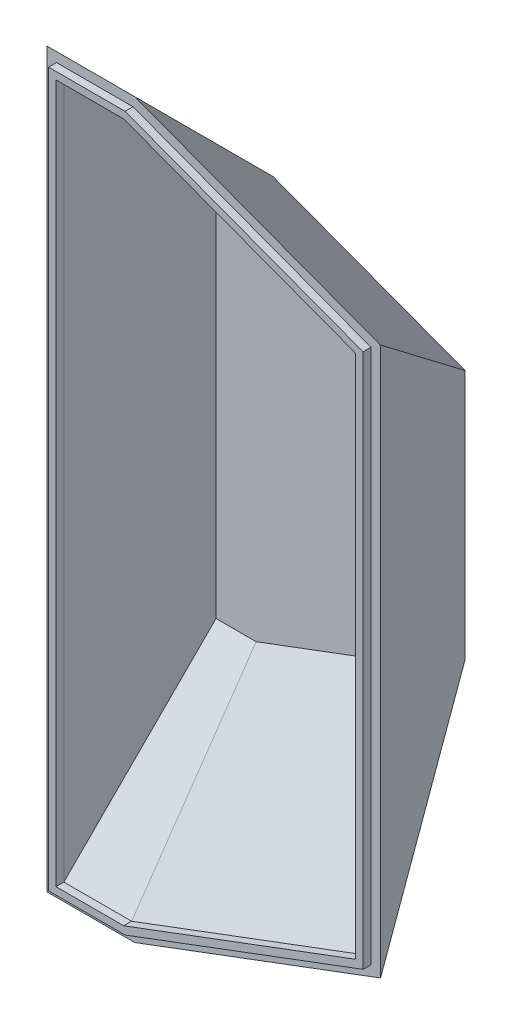
ISO-10303-21;
HEADER;
FILE_DESCRIPTION(('STEP AP214'),'2;1');
FILE_NAME('part.step','',(''),(''),'','','');
FILE_SCHEMA(('AUTOMOTIVE_DESIGN { 1 0 10303 214 1 1 1 1 }'));
ENDSEC;
DATA;
#1=APPLICATION_CONTEXT('core data for automotive mechanical design processes');
#2=APPLICATION_PROTOCOL_DEFINITION('international standard','automotive_design',2000,#1);
#3=PRODUCT_CONTEXT('',#1,'mechanical');
#4=PRODUCT('Part','Part','',(#3));
#5=PRODUCT_RELATED_PRODUCT_CATEGORY('part','',(#4));
#6=PRODUCT_DEFINITION_FORMATION('','',#4);
#7=PRODUCT_DEFINITION_CONTEXT('part definition',#1,'design');
#8=PRODUCT_DEFINITION('design','',#6,#7);
#9=PRODUCT_DEFINITION_SHAPE('','',#8);
#10=(LENGTH_UNIT() NAMED_UNIT(*) SI_UNIT(.MILLI.,.METRE.));
#11=(NAMED_UNIT(*) PLANE_ANGLE_UNIT() SI_UNIT($,.RADIAN.));
#12=(NAMED_UNIT(*) SI_UNIT($,.STERADIAN.) SOLID_ANGLE_UNIT());
#13=UNCERTAINTY_MEASURE_WITH_UNIT(LENGTH_MEASURE(1.E-05),#10,'distance_accuracy_value','');
#14=(GEOMETRIC_REPRESENTATION_CONTEXT(3) GLOBAL_UNCERTAINTY_ASSIGNED_CONTEXT((#13)) GLOBAL_UNIT_ASSIGNED_CONTEXT((#10,
#11,#12)) REPRESENTATION_CONTEXT('',''));
#15=CARTESIAN_POINT('',(0.,0.,0.));
#16=DIRECTION('',(0.,0.,1.));
#17=DIRECTION('',(1.,0.,0.));
#18=AXIS2_PLACEMENT_3D('',#15,#16,#17);
#19=CARTESIAN_POINT('',(0.550172499144787,-1.46712666438611,0.889));
#20=DIRECTION('',(0.35112344158839,-0.936329177569045,0.));
#21=DIRECTION('',(0.936329177569045,0.35112344158839,0.));
#22=AXIS2_PLACEMENT_3D('',#19,#20,#21);
#23=PLANE('',#22);
#24=CARTESIAN_POINT('',(35.6782200809877,11.7058911788049,0.));
#25=DIRECTION('',(-0.936329177569045,-0.35112344158839,0.));
#26=VECTOR('',#25,1.);
#27=LINE('',#24,#26);
#28=CARTESIAN_POINT('',(35.6782200809877,11.7058911788049,0.));
#29=VERTEX_POINT('',#28);
#30=CARTESIAN_POINT('',(9.54126046030561,1.90453132104919,0.));
#31=VERTEX_POINT('',#30);
#32=EDGE_CURVE('E193',#29,#31,#27,.T.);
#33=ORIENTED_EDGE('',*,*,#32,.T.);
#34=DIRECTION('',(0.,0.,-1.));
#35=VECTOR('',#34,1.);
#36=CARTESIAN_POINT('',(9.54126046030561,1.90453132104919,0.889));
#37=LINE('',#36,#35);
#38=CARTESIAN_POINT('',(9.54126046030561,1.90453132104919,0.889));
#39=VERTEX_POINT('',#38);
#40=EDGE_CURVE('E12',#39,#31,#37,.T.);
#41=ORIENTED_EDGE('',*,*,#40,.F.);
#42=DIRECTION('',(-0.936329177569045,-0.35112344158839,0.));
#43=VECTOR('',#42,1.);
#44=CARTESIAN_POINT('',(0.550172499144787,-1.46712666438611,0.889));
#45=LINE('',#44,#43);
#46=CARTESIAN_POINT('',(35.6782200809877,11.7058911788049,0.889));
#47=VERTEX_POINT('',#46);
#48=EDGE_CURVE('E910',#47,#39,#45,.T.);
#49=ORIENTED_EDGE('',*,*,#48,.F.);
#50=DIRECTION('',(0.,0.,-1.));
#51=VECTOR('',#50,1.);
#52=CARTESIAN_POINT('',(35.6782200809877,11.7058911788049,0.889));
#53=LINE('',#52,#51);
#54=EDGE_CURVE('E204',#47,#29,#53,.T.);
#55=ORIENTED_EDGE('',*,*,#54,.T.);
#56=EDGE_LOOP('',(#33,#41,#49,#55));
#57=FACE_BOUND('',#56,.T.);
#58=ADVANCED_FACE('F61',(#57),#23,.F.);
#59=CARTESIAN_POINT('',(0.,1.90453132104919,0.889));
#60=DIRECTION('',(0.,-1.,0.));
#61=DIRECTION('',(0.,0.,-1.));
#62=AXIS2_PLACEMENT_3D('',#59,#60,#61);
#63=PLANE('',#62);
#64=CARTESIAN_POINT('',(9.54126046030561,1.90453132104919,0.));
#65=DIRECTION('',(-1.,0.,0.));
#66=VECTOR('',#65,1.);
#67=LINE('',#64,#66);
#68=CARTESIAN_POINT('',(1.90453132104931,1.90453132104919,0.));
#69=VERTEX_POINT('',#68);
#70=EDGE_CURVE('E215',#31,#69,#67,.T.);
#71=ORIENTED_EDGE('',*,*,#70,.T.);
#72=DIRECTION('',(0.,0.,-1.));
#73=VECTOR('',#72,1.);
#74=CARTESIAN_POINT('',(1.90453132104931,1.90453132104919,0.889));
#75=LINE('',#74,#73);
#76=CARTESIAN_POINT('',(1.90453132104931,1.90453132104919,0.889));
#77=VERTEX_POINT('',#76);
#78=EDGE_CURVE('E73',#77,#69,#75,.T.);
#79=ORIENTED_EDGE('',*,*,#78,.F.);
#80=DIRECTION('',(-1.,0.,0.));
#81=VECTOR('',#80,1.);
#82=CARTESIAN_POINT('',(0.,1.90453132104919,0.889));
#83=LINE('',#82,#81);
#84=EDGE_CURVE('E912',#39,#77,#83,.T.);
#85=ORIENTED_EDGE('',*,*,#84,.F.);
#86=ORIENTED_EDGE('',*,*,#40,.T.);
#87=EDGE_LOOP('',(#71,#79,#85,#86));
#88=FACE_BOUND('',#87,.T.);
#89=ADVANCED_FACE('F220',(#88),#63,.F.);
#90=CARTESIAN_POINT('',(1.90453132104931,0.,0.889));
#91=DIRECTION('',(-1.,0.,0.));
#92=DIRECTION('',(0.,0.,1.));
#93=AXIS2_PLACEMENT_3D('',#90,#91,#92);
#94=PLANE('',#93);
#95=CARTESIAN_POINT('',(1.90453132104931,1.90453132104919,0.));
#96=DIRECTION('',(0.,1.,0.));
#97=VECTOR('',#96,1.);
#98=LINE('',#95,#97);
#99=CARTESIAN_POINT('',(1.90453132104931,80.6251592577482,0.));
#100=VERTEX_POINT('',#99);
#101=EDGE_CURVE('E304',#69,#100,#98,.T.);
#102=ORIENTED_EDGE('',*,*,#101,.T.);
#103=DIRECTION('',(0.,0.,-1.));
#104=VECTOR('',#103,1.);
#105=CARTESIAN_POINT('',(1.90453132104931,80.6251592577482,0.889));
#106=LINE('',#105,#104);
#107=CARTESIAN_POINT('',(1.90453132104931,80.6251592577482,0.889));
#108=VERTEX_POINT('',#107);
#109=EDGE_CURVE('E165',#108,#100,#106,.T.);
#110=ORIENTED_EDGE('',*,*,#109,.F.);
#111=DIRECTION('',(0.,1.,0.));
#112=VECTOR('',#111,1.);
#113=CARTESIAN_POINT('',(1.90453132104931,0.,0.889));
#114=LINE('',#113,#112);
#115=EDGE_CURVE('E150',#77,#108,#114,.T.);
#116=ORIENTED_EDGE('',*,*,#115,.F.);
#117=ORIENTED_EDGE('',*,*,#78,.T.);
#118=EDGE_LOOP('',(#102,#110,#116,#117));
#119=FACE_BOUND('',#118,.T.);
#120=ADVANCED_FACE('F229',(#119),#94,.F.);
#121=CARTESIAN_POINT('',(0.,80.6251592577482,0.889));
#122=DIRECTION('',(0.,1.,0.));
#123=DIRECTION('',(0.,0.,1.));
#124=AXIS2_PLACEMENT_3D('',#121,#122,#123);
#125=PLANE('',#124);
#126=CARTESIAN_POINT('',(1.90453132104931,80.6251592577482,0.));
#127=DIRECTION('',(1.,0.,0.));
#128=VECTOR('',#127,1.);
#129=LINE('',#126,#128);
#130=CARTESIAN_POINT('',(9.54126046030601,80.6251592577482,0.));
#131=VERTEX_POINT('',#130);
#132=EDGE_CURVE('E161',#100,#131,#129,.T.);
#133=ORIENTED_EDGE('',*,*,#132,.T.);
#134=DIRECTION('',(0.,0.,-1.));
#135=VECTOR('',#134,1.);
#136=CARTESIAN_POINT('',(9.54126046030603,80.6251592577482,0.889));
#137=LINE('',#136,#135);
#138=CARTESIAN_POINT('',(9.54126046030603,80.6251592577482,0.889));
#139=VERTEX_POINT('',#138);
#140=EDGE_CURVE('E157',#139,#131,#137,.T.);
#141=ORIENTED_EDGE('',*,*,#140,.F.);
#142=DIRECTION('',(1.,0.,0.));
#143=VECTOR('',#142,1.);
#144=CARTESIAN_POINT('',(0.,80.6251592577482,0.889));
#145=LINE('',#144,#143);
#146=EDGE_CURVE('E143',#108,#139,#145,.T.);
#147=ORIENTED_EDGE('',*,*,#146,.F.);
#148=ORIENTED_EDGE('',*,*,#109,.T.);
#149=EDGE_LOOP('',(#133,#141,#147,#148));
#150=FACE_BOUND('',#149,.T.);
#151=ADVANCED_FACE('F158',(#150),#125,.F.);
#152=CARTESIAN_POINT('',(27.6832214565578,73.8219238841537,0.889));
#153=DIRECTION('',(0.351123441588393,0.936329177569044,0.));
#154=DIRECTION('',(-0.936329177569044,0.351123441588394,0.));
#155=AXIS2_PLACEMENT_3D('',#152,#153,#154);
#156=PLANE('',#155);
#157=CARTESIAN_POINT('',(9.541260460306,80.6251592577482,0.));
#158=DIRECTION('',(0.936329177569044,-0.351123441588393,0.));
#159=VECTOR('',#158,1.);
#160=LINE('',#157,#159);
#161=CARTESIAN_POINT('',(35.6782200809877,70.8237993999925,0.));
#162=VERTEX_POINT('',#161);
#163=EDGE_CURVE('E313',#131,#162,#160,.T.);
#164=ORIENTED_EDGE('',*,*,#163,.T.);
#165=DIRECTION('',(0.,0.,-1.));
#166=VECTOR('',#165,1.);
#167=CARTESIAN_POINT('',(35.6782200809877,70.8237993999925,0.889));
#168=LINE('',#167,#166);
#169=CARTESIAN_POINT('',(35.6782200809877,70.8237993999925,0.889));
#170=VERTEX_POINT('',#169);
#171=EDGE_CURVE('E166',#170,#162,#168,.T.);
#172=ORIENTED_EDGE('',*,*,#171,.F.);
#173=DIRECTION('',(0.936329177569044,-0.351123441588394,0.));
#174=VECTOR('',#173,1.);
#175=CARTESIAN_POINT('',(27.6832214565578,73.8219238841537,0.889));
#176=LINE('',#175,#174);
#177=EDGE_CURVE('E147',#139,#170,#176,.T.);
#178=ORIENTED_EDGE('',*,*,#177,.F.);
#179=ORIENTED_EDGE('',*,*,#140,.T.);
#180=EDGE_LOOP('',(#164,#172,#178,#179));
#181=FACE_BOUND('',#180,.T.);
#182=ADVANCED_FACE('F168',(#181),#156,.F.);
#183=CARTESIAN_POINT('',(0.,1.0792344152612,0.889));
#184=DIRECTION('',(0.,-1.,0.));
#185=DIRECTION('',(1.,0.,0.));
#186=AXIS2_PLACEMENT_3D('',#183,#184,#185);
#187=PLANE('',#186);
#188=DIRECTION('',(-1.,0.,0.));
#189=VECTOR('',#188,1.);
#190=CARTESIAN_POINT('',(0.,1.0792344152612,0.));
#191=LINE('',#190,#189);
#192=CARTESIAN_POINT('',(9.69091532955481,1.07923441526121,0.));
#193=VERTEX_POINT('',#192);
#194=CARTESIAN_POINT('',(1.07923441526133,1.0792344152612,0.));
#195=VERTEX_POINT('',#194);
#196=EDGE_CURVE('E174',#193,#195,#191,.T.);
#197=ORIENTED_EDGE('',*,*,#196,.F.);
#198=DIRECTION('',(0.,0.,-1.));
#199=VECTOR('',#198,1.);
#200=CARTESIAN_POINT('',(9.69091532955481,1.07923441526121,0.889));
#201=LINE('',#200,#199);
#202=CARTESIAN_POINT('',(9.69091532955481,1.07923441526121,0.889));
#203=VERTEX_POINT('',#202);
#204=EDGE_CURVE('E116',#203,#193,#201,.T.);
#205=ORIENTED_EDGE('',*,*,#204,.F.);
#206=DIRECTION('',(-1.,0.,0.));
#207=VECTOR('',#206,1.);
#208=CARTESIAN_POINT('',(0.,1.0792344152612,0.889));
#209=LINE('',#208,#207);
#210=CARTESIAN_POINT('',(1.07923441526133,1.0792344152612,0.889));
#211=VERTEX_POINT('',#210);
#212=EDGE_CURVE('E559',#203,#211,#209,.T.);
#213=ORIENTED_EDGE('',*,*,#212,.T.);
#214=DIRECTION('',(0.,0.,-1.));
#215=VECTOR('',#214,1.);
#216=CARTESIAN_POINT('',(1.07923441526133,1.0792344152612,0.889));
#217=LINE('',#216,#215);
#218=EDGE_CURVE('E111',#211,#195,#217,.T.);
#219=ORIENTED_EDGE('',*,*,#218,.T.);
#220=EDGE_LOOP('',(#197,#205,#213,#219));
#221=FACE_BOUND('',#220,.T.);
#222=ADVANCED_FACE('F63',(#221),#187,.T.);
#223=CARTESIAN_POINT('',(0.839953589037309,-2.23987623743283,0.889));
#224=DIRECTION('',(0.35112344158839,-0.936329177569045,0.));
#225=DIRECTION('',(0.936329177569045,0.35112344158839,0.));
#226=AXIS2_PLACEMENT_3D('',#223,#224,#225);
#227=PLANE('',#226);
#228=DIRECTION('',(-0.936329177569045,-0.35112344158839,0.));
#229=VECTOR('',#228,1.);
#230=CARTESIAN_POINT('',(0.839953589037309,-2.23987623743283,0.));
#231=LINE('',#230,#229);
#232=CARTESIAN_POINT('',(36.5035169867757,11.133960036719,0.));
#233=VERTEX_POINT('',#232);
#234=EDGE_CURVE('E177',#233,#193,#231,.T.);
#235=ORIENTED_EDGE('',*,*,#234,.F.);
#236=DIRECTION('',(0.,0.,-1.));
#237=VECTOR('',#236,1.);
#238=CARTESIAN_POINT('',(36.5035169867757,11.133960036719,0.889));
#239=LINE('',#238,#237);
#240=CARTESIAN_POINT('',(36.5035169867757,11.133960036719,0.889));
#241=VERTEX_POINT('',#240);
#242=EDGE_CURVE('E201',#241,#233,#239,.T.);
#243=ORIENTED_EDGE('',*,*,#242,.F.);
#244=DIRECTION('',(-0.936329177569045,-0.35112344158839,0.));
#245=VECTOR('',#244,1.);
#246=CARTESIAN_POINT('',(0.839953589037309,-2.23987623743283,0.889));
#247=LINE('',#246,#245);
#248=EDGE_CURVE('E893',#241,#203,#247,.T.);
#249=ORIENTED_EDGE('',*,*,#248,.T.);
#250=ORIENTED_EDGE('',*,*,#204,.T.);
#251=EDGE_LOOP('',(#235,#243,#249,#250));
#252=FACE_BOUND('',#251,.T.);
#253=ADVANCED_FACE('F921',(#252),#227,.T.);
#254=CARTESIAN_POINT('',(36.5035169867757,0.,0.889));
#255=DIRECTION('',(1.,0.,0.));
#256=DIRECTION('',(0.,0.,-1.));
#257=AXIS2_PLACEMENT_3D('',#254,#255,#256);
#258=PLANE('',#257);
#259=DIRECTION('',(0.,-1.,0.));
#260=VECTOR('',#259,1.);
#261=CARTESIAN_POINT('',(36.5035169867757,0.,0.));
#262=LINE('',#261,#260);
#263=CARTESIAN_POINT('',(36.5035169867757,71.3957305420785,0.));
#264=VERTEX_POINT('',#263);
#265=EDGE_CURVE('E181',#264,#233,#262,.T.);
#266=ORIENTED_EDGE('',*,*,#265,.F.);
#267=DIRECTION('',(0.,0.,-1.));
#268=VECTOR('',#267,1.);
#269=CARTESIAN_POINT('',(36.5035169867757,71.3957305420785,0.889));
#270=LINE('',#269,#268);
#271=CARTESIAN_POINT('',(36.5035169867757,71.3957305420785,0.889));
#272=VERTEX_POINT('',#271);
#273=EDGE_CURVE('E199',#272,#264,#270,.T.);
#274=ORIENTED_EDGE('',*,*,#273,.F.);
#275=DIRECTION('',(0.,-1.,0.));
#276=VECTOR('',#275,1.);
#277=CARTESIAN_POINT('',(36.5035169867757,0.,0.889));
#278=LINE('',#277,#276);
#279=EDGE_CURVE('E896',#272,#241,#278,.T.);
#280=ORIENTED_EDGE('',*,*,#279,.T.);
#281=ORIENTED_EDGE('',*,*,#242,.T.);
#282=EDGE_LOOP('',(#266,#274,#280,#281));
#283=FACE_BOUND('',#282,.T.);
#284=ADVANCED_FACE('F925',(#283),#258,.T.);
#285=CARTESIAN_POINT('',(27.9730025464503,74.5946734572005,0.889));
#286=DIRECTION('',(0.351123441588393,0.936329177569044,0.));
#287=DIRECTION('',(-0.936329177569044,0.351123441588393,0.));
#288=AXIS2_PLACEMENT_3D('',#285,#286,#287);
#289=PLANE('',#288);
#290=DIRECTION('',(0.936329177569044,-0.351123441588393,0.));
#291=VECTOR('',#290,1.);
#292=CARTESIAN_POINT('',(27.9730025464503,74.5946734572005,0.));
#293=LINE('',#292,#291);
#294=CARTESIAN_POINT('',(9.69091532955522,81.4504561635362,0.));
#295=VERTEX_POINT('',#294);
#296=EDGE_CURVE('E184',#295,#264,#293,.T.);
#297=ORIENTED_EDGE('',*,*,#296,.F.);
#298=DIRECTION('',(0.,0.,-1.));
#299=VECTOR('',#298,1.);
#300=CARTESIAN_POINT('',(9.69091532955522,81.4504561635362,0.889));
#301=LINE('',#300,#299);
#302=CARTESIAN_POINT('',(9.69091532955522,81.4504561635362,0.889));
#303=VERTEX_POINT('',#302);
#304=EDGE_CURVE('E103',#303,#295,#301,.T.);
#305=ORIENTED_EDGE('',*,*,#304,.F.);
#306=DIRECTION('',(0.936329177569044,-0.351123441588393,0.));
#307=VECTOR('',#306,1.);
#308=CARTESIAN_POINT('',(27.9730025464503,74.5946734572005,0.889));
#309=LINE('',#308,#307);
#310=EDGE_CURVE('E900',#303,#272,#309,.T.);
#311=ORIENTED_EDGE('',*,*,#310,.T.);
#312=ORIENTED_EDGE('',*,*,#273,.T.);
#313=EDGE_LOOP('',(#297,#305,#311,#312));
#314=FACE_BOUND('',#313,.T.);
#315=ADVANCED_FACE('F929',(#314),#289,.T.);
#316=CARTESIAN_POINT('',(0.,81.4504561635362,0.889));
#317=DIRECTION('',(0.,1.,0.));
#318=DIRECTION('',(0.,0.,1.));
#319=AXIS2_PLACEMENT_3D('',#316,#317,#318);
#320=PLANE('',#319);
#321=DIRECTION('',(1.,0.,0.));
#322=VECTOR('',#321,1.);
#323=CARTESIAN_POINT('',(0.,81.4504561635362,0.));
#324=LINE('',#323,#322);
#325=CARTESIAN_POINT('',(1.07923441526133,81.4504561635362,0.));
#326=VERTEX_POINT('',#325);
#327=EDGE_CURVE('E187',#326,#295,#324,.T.);
#328=ORIENTED_EDGE('',*,*,#327,.F.);
#329=DIRECTION('',(0.,0.,-1.));
#330=VECTOR('',#329,1.);
#331=CARTESIAN_POINT('',(1.07923441526133,81.4504561635362,0.889));
#332=LINE('',#331,#330);
#333=CARTESIAN_POINT('',(1.07923441526133,81.4504561635362,0.889));
#334=VERTEX_POINT('',#333);
#335=EDGE_CURVE('E195',#334,#326,#332,.T.);
#336=ORIENTED_EDGE('',*,*,#335,.F.);
#337=DIRECTION('',(1.,0.,0.));
#338=VECTOR('',#337,1.);
#339=CARTESIAN_POINT('',(0.,81.4504561635362,0.889));
#340=LINE('',#339,#338);
#341=EDGE_CURVE('E905',#334,#303,#340,.T.);
#342=ORIENTED_EDGE('',*,*,#341,.T.);
#343=ORIENTED_EDGE('',*,*,#304,.T.);
#344=EDGE_LOOP('',(#328,#336,#342,#343));
#345=FACE_BOUND('',#344,.T.);
#346=ADVANCED_FACE('F918',(#345),#320,.T.);
#347=CARTESIAN_POINT('',(1.07923441526133,0.,0.889));
#348=DIRECTION('',(-1.,0.,0.));
#349=DIRECTION('',(0.,0.,1.));
#350=AXIS2_PLACEMENT_3D('',#347,#348,#349);
#351=PLANE('',#350);
#352=DIRECTION('',(0.,1.,0.));
#353=VECTOR('',#352,1.);
#354=CARTESIAN_POINT('',(1.07923441526133,0.,0.));
#355=LINE('',#354,#353);
#356=EDGE_CURVE('E190',#195,#326,#355,.T.);
#357=ORIENTED_EDGE('',*,*,#356,.F.);
#358=ORIENTED_EDGE('',*,*,#218,.F.);
#359=DIRECTION('',(0.,1.,0.));
#360=VECTOR('',#359,1.);
#361=CARTESIAN_POINT('',(1.07923441526133,0.,0.889));
#362=LINE('',#361,#360);
#363=EDGE_CURVE('E907',#211,#334,#362,.T.);
#364=ORIENTED_EDGE('',*,*,#363,.T.);
#365=ORIENTED_EDGE('',*,*,#335,.T.);
#366=EDGE_LOOP('',(#357,#358,#364,#365));
#367=FACE_BOUND('',#366,.T.);
#368=ADVANCED_FACE('F236',(#367),#351,.T.);
#369=CARTESIAN_POINT('',(35.6782200809877,0.,0.889));
#370=DIRECTION('',(1.,0.,0.));
#371=DIRECTION('',(0.,0.,-1.));
#372=AXIS2_PLACEMENT_3D('',#369,#370,#371);
#373=PLANE('',#372);
#374=CARTESIAN_POINT('',(35.6782200809877,70.8237993999925,0.));
#375=DIRECTION('',(0.,-1.,0.));
#376=VECTOR('',#375,1.);
#377=LINE('',#374,#376);
#378=EDGE_CURVE('E258',#162,#29,#377,.T.);
#379=ORIENTED_EDGE('',*,*,#378,.T.);
#380=ORIENTED_EDGE('',*,*,#54,.F.);
#381=DIRECTION('',(0.,-1.,0.));
#382=VECTOR('',#381,1.);
#383=CARTESIAN_POINT('',(35.6782200809877,0.,0.889));
#384=LINE('',#383,#382);
#385=EDGE_CURVE('E82',#170,#47,#384,.T.);
#386=ORIENTED_EDGE('',*,*,#385,.F.);
#387=ORIENTED_EDGE('',*,*,#171,.T.);
#388=EDGE_LOOP('',(#379,#380,#386,#387));
#389=FACE_BOUND('',#388,.T.);
#390=ADVANCED_FACE('F264',(#389),#373,.F.);
#391=CARTESIAN_POINT('',(0.,0.,0.889));
#392=DIRECTION('',(0.,0.,1.));
#393=DIRECTION('',(1.,0.,0.));
#394=AXIS2_PLACEMENT_3D('',#391,#392,#393);
#395=PLANE('',#394);
#396=ORIENTED_EDGE('',*,*,#212,.F.);
#397=ORIENTED_EDGE('',*,*,#248,.F.);
#398=ORIENTED_EDGE('',*,*,#279,.F.);
#399=ORIENTED_EDGE('',*,*,#310,.F.);
#400=ORIENTED_EDGE('',*,*,#341,.F.);
#401=ORIENTED_EDGE('',*,*,#363,.F.);
#402=EDGE_LOOP('',(#396,#397,#398,#399,#400,#401));
#403=FACE_BOUND('',#402,.T.);
#404=ORIENTED_EDGE('',*,*,#48,.T.);
#405=ORIENTED_EDGE('',*,*,#84,.T.);
#406=ORIENTED_EDGE('',*,*,#115,.T.);
#407=ORIENTED_EDGE('',*,*,#146,.T.);
#408=ORIENTED_EDGE('',*,*,#177,.T.);
#409=ORIENTED_EDGE('',*,*,#385,.T.);
#410=EDGE_LOOP('',(#404,#405,#406,#407,#408,#409));
#411=FACE_BOUND('',#410,.T.);
#412=ADVANCED_FACE('F145',(#403,#411),#395,.T.);
#413=CARTESIAN_POINT('',(0.,0.,-19.05));
#414=DIRECTION('',(0.,0.,1.));
#415=DIRECTION('',(1.,0.,0.));
#416=AXIS2_PLACEMENT_3D('',#413,#414,#415);
#417=PLANE('',#416);
#418=DIRECTION('',(-1.,0.,0.));
#419=VECTOR('',#418,1.);
#420=CARTESIAN_POINT('',(6.43219406811454,63.4796905787975,-19.05));
#421=LINE('',#420,#419);
#422=CARTESIAN_POINT('',(6.43219406811454,63.4796905787975,-19.05));
#423=VERTEX_POINT('',#422);
#424=CARTESIAN_POINT('',(0.,63.4796905787975,-19.05));
#425=VERTEX_POINT('',#424);
#426=EDGE_CURVE('E524',#423,#425,#421,.T.);
#427=ORIENTED_EDGE('',*,*,#426,.F.);
#428=DIRECTION('',(-0.936329177569044,0.351123441588393,0.));
#429=VECTOR('',#428,1.);
#430=CARTESIAN_POINT('',(28.057751402037,55.3701065785765,-19.05));
#431=LINE('',#430,#429);
#432=CARTESIAN_POINT('',(28.057751402037,55.3701065785765,-19.05));
#433=VERTEX_POINT('',#432);
#434=EDGE_CURVE('E178',#433,#423,#431,.T.);
#435=ORIENTED_EDGE('',*,*,#434,.F.);
#436=DIRECTION('',(0.,-1.,0.));
#437=VECTOR('',#436,1.);
#438=CARTESIAN_POINT('',(28.057751402037,55.3701065785765,-19.05));
#439=LINE('',#438,#437);
#440=CARTESIAN_POINT('',(28.057751402037,27.1595840002208,-19.05));
#441=VERTEX_POINT('',#440);
#442=EDGE_CURVE('E542',#433,#441,#439,.T.);
#443=ORIENTED_EDGE('',*,*,#442,.T.);
#444=DIRECTION('',(0.936329177569048,0.351123441588384,0.));
#445=VECTOR('',#444,1.);
#446=CARTESIAN_POINT('',(6.43219406811436,19.05,-19.05));
#447=LINE('',#446,#445);
#448=CARTESIAN_POINT('',(6.43219406811436,19.05,-19.05));
#449=VERTEX_POINT('',#448);
#450=EDGE_CURVE('E605',#449,#441,#447,.T.);
#451=ORIENTED_EDGE('',*,*,#450,.F.);
#452=DIRECTION('',(1.,0.,0.));
#453=VECTOR('',#452,1.);
#454=CARTESIAN_POINT('',(0.,19.05,-19.05));
#455=LINE('',#454,#453);
#456=CARTESIAN_POINT('',(0.,19.05,-19.05));
#457=VERTEX_POINT('',#456);
#458=EDGE_CURVE('E603',#457,#449,#455,.T.);
#459=ORIENTED_EDGE('',*,*,#458,.F.);
#460=DIRECTION('',(0.,-1.,0.));
#461=VECTOR('',#460,1.);
#462=CARTESIAN_POINT('',(0.,63.4796905787975,-19.05));
#463=LINE('',#462,#461);
#464=EDGE_CURVE('E549',#425,#457,#463,.T.);
#465=ORIENTED_EDGE('',*,*,#464,.F.);
#466=EDGE_LOOP('',(#427,#435,#443,#451,#459,#465));
#467=FACE_BOUND('',#466,.T.);
#468=ADVANCED_FACE('F547',(#467),#417,.F.);
#469=CARTESIAN_POINT('',(0.,0.,0.));
#470=DIRECTION('',(0.,0.,1.));
#471=DIRECTION('',(1.,0.,0.));
#472=AXIS2_PLACEMENT_3D('',#469,#470,#471);
#473=PLANE('',#472);
#474=ORIENTED_EDGE('',*,*,#234,.T.);
#475=ORIENTED_EDGE('',*,*,#196,.T.);
#476=ORIENTED_EDGE('',*,*,#356,.T.);
#477=ORIENTED_EDGE('',*,*,#327,.T.);
#478=ORIENTED_EDGE('',*,*,#296,.T.);
#479=ORIENTED_EDGE('',*,*,#265,.T.);
#480=EDGE_LOOP('',(#474,#475,#476,#477,#478,#479));
#481=FACE_BOUND('',#480,.T.);
#482=DIRECTION('',(0.936329177569046,0.351123441588387,0.));
#483=VECTOR('',#482,1.);
#484=CARTESIAN_POINT('',(9.88661785088064,0.,0.));
#485=LINE('',#484,#483);
#486=CARTESIAN_POINT('',(9.88661785088064,0.,0.));
#487=VERTEX_POINT('',#486);
#488=CARTESIAN_POINT('',(37.582751402037,10.3860500816835,0.));
#489=VERTEX_POINT('',#488);
#490=EDGE_CURVE('E677',#487,#489,#485,.T.);
#491=ORIENTED_EDGE('',*,*,#490,.T.);
#492=DIRECTION('',(0.,1.,0.));
#493=VECTOR('',#492,1.);
#494=CARTESIAN_POINT('',(37.582751402037,10.3860500816835,0.));
#495=LINE('',#494,#493);
#496=CARTESIAN_POINT('',(37.582751402037,72.1436404971138,0.));
#497=VERTEX_POINT('',#496);
#498=EDGE_CURVE('E670',#489,#497,#495,.T.);
#499=ORIENTED_EDGE('',*,*,#498,.T.);
#500=DIRECTION('',(-0.936329177569043,0.351123441588396,0.));
#501=VECTOR('',#500,1.);
#502=CARTESIAN_POINT('',(37.582751402037,72.1436404971138,0.));
#503=LINE('',#502,#501);
#504=CARTESIAN_POINT('',(9.88661785088086,82.5296905787975,0.));
#505=VERTEX_POINT('',#504);
#506=EDGE_CURVE('E676',#497,#505,#503,.T.);
#507=ORIENTED_EDGE('',*,*,#506,.T.);
#508=DIRECTION('',(-1.,0.,0.));
#509=VECTOR('',#508,1.);
#510=CARTESIAN_POINT('',(9.88661785088086,82.5296905787975,0.));
#511=LINE('',#510,#509);
#512=CARTESIAN_POINT('',(0.,82.5296905787975,0.));
#513=VERTEX_POINT('',#512);
#514=EDGE_CURVE('E528',#505,#513,#511,.T.);
#515=ORIENTED_EDGE('',*,*,#514,.T.);
#516=DIRECTION('',(0.,-1.,0.));
#517=VECTOR('',#516,1.);
#518=CARTESIAN_POINT('',(0.,82.5296905787975,0.));
#519=LINE('',#518,#517);
#520=CARTESIAN_POINT('',(0.,0.,0.));
#521=VERTEX_POINT('',#520);
#522=EDGE_CURVE('E813',#513,#521,#519,.T.);
#523=ORIENTED_EDGE('',*,*,#522,.T.);
#524=DIRECTION('',(1.,0.,0.));
#525=VECTOR('',#524,1.);
#526=CARTESIAN_POINT('',(0.,0.,0.));
#527=LINE('',#526,#525);
#528=EDGE_CURVE('E698',#521,#487,#527,.T.);
#529=ORIENTED_EDGE('',*,*,#528,.T.);
#530=EDGE_LOOP('',(#491,#499,#507,#515,#523,#529));
#531=FACE_BOUND('',#530,.T.);
#532=ADVANCED_FACE('F569',(#481,#531),#473,.T.);
#533=CARTESIAN_POINT('',(30.0662011216296,0.,-15.0331005608148));
#534=DIRECTION('',(-0.894427190999916,0.,0.447213595499958));
#535=DIRECTION('',(0.447213595499958,0.,0.894427190999916));
#536=AXIS2_PLACEMENT_3D('',#533,#534,#535);
#537=PLANE('',#536);
#538=DIRECTION('',(-0.351339801941936,0.618709720189528,-0.702679603883873));
#539=VECTOR('',#538,1.);
#540=CARTESIAN_POINT('',(37.582751402037,10.3860500816835,0.));
#541=LINE('',#540,#539);
#542=EDGE_CURVE('E693',#489,#441,#541,.T.);
#543=ORIENTED_EDGE('',*,*,#542,.T.);
#544=ORIENTED_EDGE('',*,*,#442,.F.);
#545=DIRECTION('',(-0.351339801941937,-0.618709720189527,-0.702679603883874));
#546=VECTOR('',#545,1.);
#547=CARTESIAN_POINT('',(37.582751402037,72.1436404971138,0.));
#548=LINE('',#547,#546);
#549=EDGE_CURVE('E538',#497,#433,#548,.T.);
#550=ORIENTED_EDGE('',*,*,#549,.F.);
#551=ORIENTED_EDGE('',*,*,#498,.F.);
#552=EDGE_LOOP('',(#543,#544,#550,#551));
#553=FACE_BOUND('',#552,.T.);
#554=ADVANCED_FACE('F633',(#553),#537,.F.);
#555=CARTESIAN_POINT('',(14.1759735243088,37.8025960648232,-40.3731902950718));
#556=DIRECTION('',(0.248281766580712,0.662084710881895,-0.707106781186546));
#557=DIRECTION('',(0.,0.729963502737271,0.68348612617341));
#558=AXIS2_PLACEMENT_3D('',#555,#556,#557);
#559=PLANE('',#558);
#560=ORIENTED_EDGE('',*,*,#549,.T.);
#561=ORIENTED_EDGE('',*,*,#434,.T.);
#562=DIRECTION('',(-0.127181670528606,-0.701364677853666,-0.701364677853666));
#563=VECTOR('',#562,1.);
#564=CARTESIAN_POINT('',(9.88661785088086,82.5296905787975,0.));
#565=LINE('',#564,#563);
#566=EDGE_CURVE('E520',#505,#423,#565,.T.);
#567=ORIENTED_EDGE('',*,*,#566,.F.);
#568=ORIENTED_EDGE('',*,*,#506,.F.);
#569=EDGE_LOOP('',(#560,#561,#567,#568));
#570=FACE_BOUND('',#569,.T.);
#571=ADVANCED_FACE('F536',(#570),#559,.T.);
#572=CARTESIAN_POINT('',(0.609449045602203,-1.62519745493925,-1.73571164273518));
#573=DIRECTION('',(0.248281766580705,-0.662084710881896,-0.707106781186548));
#574=DIRECTION('',(0.,0.729963502737271,-0.68348612617341));
#575=AXIS2_PLACEMENT_3D('',#572,#573,#574);
#576=PLANE('',#575);
#577=DIRECTION('',(-0.127181670528604,0.701364677853666,-0.701364677853666));
#578=VECTOR('',#577,1.);
#579=CARTESIAN_POINT('',(9.88661785088064,0.,0.));
#580=LINE('',#579,#578);
#581=EDGE_CURVE('E692',#487,#449,#580,.T.);
#582=ORIENTED_EDGE('',*,*,#581,.T.);
#583=ORIENTED_EDGE('',*,*,#450,.T.);
#584=ORIENTED_EDGE('',*,*,#542,.F.);
#585=ORIENTED_EDGE('',*,*,#490,.F.);
#586=EDGE_LOOP('',(#582,#583,#584,#585));
#587=FACE_BOUND('',#586,.T.);
#588=ADVANCED_FACE('F721',(#587),#576,.T.);
#589=CARTESIAN_POINT('',(0.,0.,0.));
#590=DIRECTION('',(0.,-0.707106781186548,-0.707106781186548));
#591=DIRECTION('',(0.,0.707106781186548,-0.707106781186548));
#592=AXIS2_PLACEMENT_3D('',#589,#590,#591);
#593=PLANE('',#592);
#594=DIRECTION('',(0.,0.707106781186547,-0.707106781186547));
#595=VECTOR('',#594,1.);
#596=CARTESIAN_POINT('',(0.,0.,0.));
#597=LINE('',#596,#595);
#598=EDGE_CURVE('E696',#521,#457,#597,.T.);
#599=ORIENTED_EDGE('',*,*,#598,.T.);
#600=ORIENTED_EDGE('',*,*,#458,.T.);
#601=ORIENTED_EDGE('',*,*,#581,.F.);
#602=ORIENTED_EDGE('',*,*,#528,.F.);
#603=EDGE_LOOP('',(#599,#600,#601,#602));
#604=FACE_BOUND('',#603,.T.);
#605=ADVANCED_FACE('F730',(#604),#593,.T.);
#606=CARTESIAN_POINT('',(0.,0.,0.));
#607=DIRECTION('',(1.,0.,0.));
#608=DIRECTION('',(0.,0.,-1.));
#609=AXIS2_PLACEMENT_3D('',#606,#607,#608);
#610=PLANE('',#609);
#611=DIRECTION('',(0.,-0.707106781186547,-0.707106781186547));
#612=VECTOR('',#611,1.);
#613=CARTESIAN_POINT('',(0.,82.5296905787975,0.));
#614=LINE('',#613,#612);
#615=EDGE_CURVE('E532',#513,#425,#614,.T.);
#616=ORIENTED_EDGE('',*,*,#615,.T.);
#617=ORIENTED_EDGE('',*,*,#464,.T.);
#618=ORIENTED_EDGE('',*,*,#598,.F.);
#619=ORIENTED_EDGE('',*,*,#522,.F.);
#620=EDGE_LOOP('',(#616,#617,#618,#619));
#621=FACE_BOUND('',#620,.T.);
#622=ADVANCED_FACE('F761',(#621),#610,.F.);
#623=CARTESIAN_POINT('',(0.,41.2648452893988,-41.2648452893988));
#624=DIRECTION('',(0.,0.707106781186548,-0.707106781186547));
#625=DIRECTION('',(0.,0.707106781186547,0.707106781186548));
#626=AXIS2_PLACEMENT_3D('',#623,#624,#625);
#627=PLANE('',#626);
#628=ORIENTED_EDGE('',*,*,#566,.T.);
#629=ORIENTED_EDGE('',*,*,#426,.T.);
#630=ORIENTED_EDGE('',*,*,#615,.F.);
#631=ORIENTED_EDGE('',*,*,#514,.F.);
#632=EDGE_LOOP('',(#628,#629,#630,#631));
#633=FACE_BOUND('',#632,.T.);
#634=ADVANCED_FACE('F421',(#633),#627,.T.);
#635=CARTESIAN_POINT('',(0.,0.,-17.145));
#636=DIRECTION('',(0.,0.,-1.));
#637=DIRECTION('',(-1.,0.,0.));
#638=AXIS2_PLACEMENT_3D('',#635,#636,#637);
#639=PLANE('',#638);
#640=DIRECTION('',(0.,-1.,0.));
#641=VECTOR('',#640,1.);
#642=CARTESIAN_POINT('',(27.105251402037,55.7272940785765,-17.145));
#643=LINE('',#642,#641);
#644=CARTESIAN_POINT('',(27.105251402037,55.7272940785765,-17.145));
#645=VERTEX_POINT('',#644);
#646=CARTESIAN_POINT('',(27.105251402037,26.8023965002208,-17.145));
#647=VERTEX_POINT('',#646);
#648=EDGE_CURVE('E379',#645,#647,#643,.T.);
#649=ORIENTED_EDGE('',*,*,#648,.F.);
#650=DIRECTION('',(0.936329177569044,-0.351123441588394,0.));
#651=VECTOR('',#650,1.);
#652=CARTESIAN_POINT('',(6.43219406811457,63.4796905787975,-17.145));
#653=LINE('',#652,#651);
#654=CARTESIAN_POINT('',(6.43219406811457,63.4796905787975,-17.145));
#655=VERTEX_POINT('',#654);
#656=EDGE_CURVE('E398',#655,#645,#653,.T.);
#657=ORIENTED_EDGE('',*,*,#656,.F.);
#658=DIRECTION('',(1.,0.,0.));
#659=VECTOR('',#658,1.);
#660=CARTESIAN_POINT('',(1.905,63.4796905787975,-17.145));
#661=LINE('',#660,#659);
#662=CARTESIAN_POINT('',(1.905,63.4796905787975,-17.145));
#663=VERTEX_POINT('',#662);
#664=EDGE_CURVE('E840',#663,#655,#661,.T.);
#665=ORIENTED_EDGE('',*,*,#664,.F.);
#666=DIRECTION('',(0.,-1.,0.));
#667=VECTOR('',#666,1.);
#668=CARTESIAN_POINT('',(1.905,63.4796905787975,-17.145));
#669=LINE('',#668,#667);
#670=CARTESIAN_POINT('',(1.905,19.05,-17.145));
#671=VERTEX_POINT('',#670);
#672=EDGE_CURVE('E465',#663,#671,#669,.T.);
#673=ORIENTED_EDGE('',*,*,#672,.T.);
#674=DIRECTION('',(-1.,0.,0.));
#675=VECTOR('',#674,1.);
#676=CARTESIAN_POINT('',(6.43219406811436,19.05,-17.145));
#677=LINE('',#676,#675);
#678=CARTESIAN_POINT('',(6.43219406811436,19.05,-17.145));
#679=VERTEX_POINT('',#678);
#680=EDGE_CURVE('E393',#679,#671,#677,.T.);
#681=ORIENTED_EDGE('',*,*,#680,.F.);
#682=DIRECTION('',(-0.936329177569048,-0.351123441588384,0.));
#683=VECTOR('',#682,1.);
#684=CARTESIAN_POINT('',(27.105251402037,26.8023965002208,-17.145));
#685=LINE('',#684,#683);
#686=EDGE_CURVE('E456',#647,#679,#685,.T.);
#687=ORIENTED_EDGE('',*,*,#686,.F.);
#688=EDGE_LOOP('',(#649,#657,#665,#673,#681,#687));
#689=FACE_BOUND('',#688,.T.);
#690=ADVANCED_FACE('F417',(#689),#639,.F.);
#691=CARTESIAN_POINT('',(0.,0.952239629566851,0.952265660168806));
#692=DIRECTION('',(0.,-0.707097116450489,-0.70711644579051));
#693=DIRECTION('',(0.,0.70711644579051,-0.707097116450489));
#694=AXIS2_PLACEMENT_3D('',#691,#692,#693);
#695=PLANE('',#694);
#696=DIRECTION('',(0.12718338070622,-0.701374108915278,0.701354936544569));
#697=VECTOR('',#696,1.);
#698=CARTESIAN_POINT('',(6.43219406811436,19.05,-17.145));
#699=LINE('',#698,#697);
#700=EDGE_CURVE('E330',#679,#31,#699,.T.);
#701=ORIENTED_EDGE('',*,*,#700,.F.);
#702=ORIENTED_EDGE('',*,*,#680,.T.);
#703=DIRECTION('',(-1.93293400122122E-05,-0.707116445658412,0.707097116318395));
#704=VECTOR('',#703,1.);
#705=CARTESIAN_POINT('',(1.905,19.05,-17.145));
#706=LINE('',#705,#704);
#707=EDGE_CURVE('E372',#671,#69,#706,.T.);
#708=ORIENTED_EDGE('',*,*,#707,.T.);
#709=ORIENTED_EDGE('',*,*,#70,.F.);
#710=EDGE_LOOP('',(#701,#702,#708,#709));
#711=FACE_BOUND('',#710,.T.);
#712=ADVANCED_FACE('F388',(#711),#695,.F.);
#713=CARTESIAN_POINT('',(1.90453131962612,0.,5.20626270301357E-05));
#714=DIRECTION('',(-0.999999999626366,0.,-2.73361884229364E-05));
#715=DIRECTION('',(-2.73361884229364E-05,0.,0.999999999626366));
#716=AXIS2_PLACEMENT_3D('',#713,#714,#715);
#717=PLANE('',#716);
#718=ORIENTED_EDGE('',*,*,#707,.F.);
#719=ORIENTED_EDGE('',*,*,#672,.F.);
#720=DIRECTION('',(-1.93293400122212E-05,0.70711644565841,0.707097116318397));
#721=VECTOR('',#720,1.);
#722=CARTESIAN_POINT('',(1.905,63.4796905787975,-17.145));
#723=LINE('',#722,#721);
#724=EDGE_CURVE('E829',#663,#100,#723,.T.);
#725=ORIENTED_EDGE('',*,*,#724,.T.);
#726=ORIENTED_EDGE('',*,*,#101,.F.);
#727=EDGE_LOOP('',(#718,#719,#725,#726));
#728=FACE_BOUND('',#727,.T.);
#729=ADVANCED_FACE('F354',(#728),#717,.F.);
#730=CARTESIAN_POINT('',(0.275078729865622,-0.733543279641662,-0.783445981917918));
#731=DIRECTION('',(0.248278373065324,-0.662075661507532,-0.707116445790507));
#732=DIRECTION('',(0.,0.729972824306384,-0.683476170597162));
#733=AXIS2_PLACEMENT_3D('',#730,#731,#732);
#734=PLANE('',#733);
#735=DIRECTION('',(0.351353745526929,-0.618713760388535,0.70266907446541));
#736=VECTOR('',#735,1.);
#737=CARTESIAN_POINT('',(27.105251402037,26.8023965002208,-17.145));
#738=LINE('',#737,#736);
#739=EDGE_CURVE('E327',#647,#29,#738,.T.);
#740=ORIENTED_EDGE('',*,*,#739,.F.);
#741=ORIENTED_EDGE('',*,*,#686,.T.);
#742=ORIENTED_EDGE('',*,*,#700,.T.);
#743=ORIENTED_EDGE('',*,*,#32,.F.);
#744=EDGE_LOOP('',(#740,#741,#742,#743));
#745=FACE_BOUND('',#744,.T.);
#746=ADVANCED_FACE('F323',(#745),#734,.F.);
#747=CARTESIAN_POINT('',(28.5419518651879,0.,-14.2717561607683));
#748=DIRECTION('',(0.894417410800889,0.,-0.447233155363322));
#749=DIRECTION('',(-0.447233155363322,0.,-0.894417410800889));
#750=AXIS2_PLACEMENT_3D('',#747,#748,#749);
#751=PLANE('',#750);
#752=DIRECTION('',(0.351353745526928,0.618713760388538,0.702669074465408));
#753=VECTOR('',#752,1.);
#754=CARTESIAN_POINT('',(27.105251402037,55.7272940785765,-17.145));
#755=LINE('',#754,#753);
#756=EDGE_CURVE('E371',#645,#162,#755,.T.);
#757=ORIENTED_EDGE('',*,*,#756,.F.);
#758=ORIENTED_EDGE('',*,*,#648,.T.);
#759=ORIENTED_EDGE('',*,*,#739,.T.);
#760=ORIENTED_EDGE('',*,*,#378,.F.);
#761=EDGE_LOOP('',(#757,#758,#759,#760));
#762=FACE_BOUND('',#761,.T.);
#763=ADVANCED_FACE('F353',(#762),#751,.F.);
#764=CARTESIAN_POINT('',(13.8412323565714,36.9099529508569,-39.4209246198186));
#765=DIRECTION('',(0.248278373065325,0.66207566150753,-0.707116445790509));
#766=DIRECTION('',(0.,0.729972824306387,0.683476170597159));
#767=AXIS2_PLACEMENT_3D('',#764,#765,#766);
#768=PLANE('',#767);
#769=DIRECTION('',(0.127183380706229,0.701374108915275,0.70135493654457));
#770=VECTOR('',#769,1.);
#771=CARTESIAN_POINT('',(6.43219406811457,63.4796905787975,-17.145));
#772=LINE('',#771,#770);
#773=EDGE_CURVE('E830',#655,#131,#772,.T.);
#774=ORIENTED_EDGE('',*,*,#773,.F.);
#775=ORIENTED_EDGE('',*,*,#656,.T.);
#776=ORIENTED_EDGE('',*,*,#756,.T.);
#777=ORIENTED_EDGE('',*,*,#163,.F.);
#778=EDGE_LOOP('',(#774,#775,#776,#777));
#779=FACE_BOUND('',#778,.T.);
#780=ADVANCED_FACE('F854',(#779),#768,.F.);
#781=CARTESIAN_POINT('',(0.,40.3114776516633,-40.3125796138124));
#782=DIRECTION('',(0.,0.707097116450492,-0.707116445790508));
#783=DIRECTION('',(0.,0.707116445790508,0.707097116450492));
#784=AXIS2_PLACEMENT_3D('',#781,#782,#783);
#785=PLANE('',#784);
#786=ORIENTED_EDGE('',*,*,#724,.F.);
#787=ORIENTED_EDGE('',*,*,#664,.T.);
#788=ORIENTED_EDGE('',*,*,#773,.T.);
#789=ORIENTED_EDGE('',*,*,#132,.F.);
#790=EDGE_LOOP('',(#786,#787,#788,#789));
#791=FACE_BOUND('',#790,.T.);
#792=ADVANCED_FACE('F635',(#791),#785,.F.);
#793=CLOSED_SHELL('',(#58,#89,#120,#151,#182,#222,#253,#284,#315,#346,#368,#390,#412,#468,#532,
#554,#571,#588,#605,#622,#634,#690,#712,#729,#746,#763,#780,#792));
#794=MANIFOLD_SOLID_BREP('B2',#793);
#795=ADVANCED_BREP_SHAPE_REPRESENTATION('',(#18,#794),#14);
#796=SHAPE_DEFINITION_REPRESENTATION(#9,#795);
ENDSEC;
END-ISO-10303-21;
